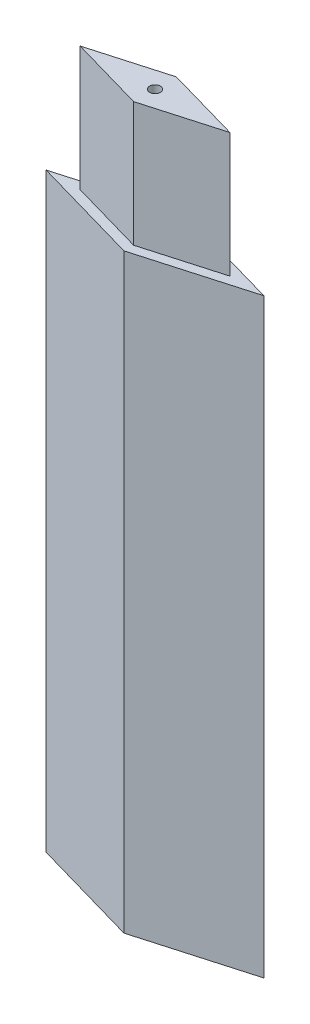
ISO-10303-21;
HEADER;
FILE_DESCRIPTION(('STEP AP214'),'2;1');
FILE_NAME('part.step','',(''),(''),'','','');
FILE_SCHEMA(('AUTOMOTIVE_DESIGN { 1 0 10303 214 1 1 1 1 }'));
ENDSEC;
DATA;
#1=APPLICATION_CONTEXT('core data for automotive mechanical design processes');
#2=APPLICATION_PROTOCOL_DEFINITION('international standard','automotive_design',2000,#1);
#3=PRODUCT_CONTEXT('',#1,'mechanical');
#4=PRODUCT('Part','Part','',(#3));
#5=PRODUCT_RELATED_PRODUCT_CATEGORY('part','',(#4));
#6=PRODUCT_DEFINITION_FORMATION('','',#4);
#7=PRODUCT_DEFINITION_CONTEXT('part definition',#1,'design');
#8=PRODUCT_DEFINITION('design','',#6,#7);
#9=PRODUCT_DEFINITION_SHAPE('','',#8);
#10=(LENGTH_UNIT() NAMED_UNIT(*) SI_UNIT(.MILLI.,.METRE.));
#11=(NAMED_UNIT(*) PLANE_ANGLE_UNIT() SI_UNIT($,.RADIAN.));
#12=(NAMED_UNIT(*) SI_UNIT($,.STERADIAN.) SOLID_ANGLE_UNIT());
#13=UNCERTAINTY_MEASURE_WITH_UNIT(LENGTH_MEASURE(1.E-05),#10,'distance_accuracy_value','');
#14=(GEOMETRIC_REPRESENTATION_CONTEXT(3) GLOBAL_UNCERTAINTY_ASSIGNED_CONTEXT((#13)) GLOBAL_UNIT_ASSIGNED_CONTEXT((#10,
#11,#12)) REPRESENTATION_CONTEXT('',''));
#15=CARTESIAN_POINT('',(0.,0.,0.));
#16=DIRECTION('',(0.,0.,1.));
#17=DIRECTION('',(1.,0.,0.));
#18=AXIS2_PLACEMENT_3D('',#15,#16,#17);
#19=CARTESIAN_POINT('',(-35.,432.,-10.000025));
#20=DIRECTION('',(0.,1.,0.));
#21=DIRECTION('',(0.,0.,1.));
#22=AXIS2_PLACEMENT_3D('',#19,#20,#21);
#23=PLANE('',#22);
#24=CARTESIAN_POINT('',(0.,432.,0.));
#25=DIRECTION('',(0.,1.,0.));
#26=DIRECTION('',(0.,0.,1.));
#27=AXIS2_PLACEMENT_3D('',#24,#25,#26);
#28=CIRCLE('',#27,1.75);
#29=CARTESIAN_POINT('',(0.,432.,1.75));
#30=VERTEX_POINT('',#29);
#31=EDGE_CURVE('E238',#30,#30,#28,.F.);
#32=ORIENTED_EDGE('',*,*,#31,.T.);
#33=EDGE_LOOP('',(#32));
#34=FACE_BOUND('',#33,.T.);
#35=DIRECTION('',(0.961523947640823,0.,-0.274721127897378));
#36=VECTOR('',#35,1.);
#37=CARTESIAN_POINT('',(0.,432.,6.87995290459406));
#38=LINE('',#37,#36);
#39=CARTESIAN_POINT('',(0.,432.,6.87995290459406));
#40=VERTEX_POINT('',#39);
#41=CARTESIAN_POINT('',(24.0798351660792,432.,0.));
#42=VERTEX_POINT('',#41);
#43=EDGE_CURVE('E171',#40,#42,#38,.T.);
#44=ORIENTED_EDGE('',*,*,#43,.T.);
#45=DIRECTION('',(-0.961523947640823,0.,-0.274721127897378));
#46=VECTOR('',#45,1.);
#47=CARTESIAN_POINT('',(24.0798351660792,432.,0.));
#48=LINE('',#47,#46);
#49=CARTESIAN_POINT('',(0.,432.,-6.87995290459406));
#50=VERTEX_POINT('',#49);
#51=EDGE_CURVE('E178',#42,#50,#48,.T.);
#52=ORIENTED_EDGE('',*,*,#51,.T.);
#53=DIRECTION('',(-0.961523947640823,0.,0.274721127897378));
#54=VECTOR('',#53,1.);
#55=CARTESIAN_POINT('',(0.,432.,-6.87995290459406));
#56=LINE('',#55,#54);
#57=CARTESIAN_POINT('',(-24.0798351660792,432.,0.));
#58=VERTEX_POINT('',#57);
#59=EDGE_CURVE('E152',#50,#58,#56,.T.);
#60=ORIENTED_EDGE('',*,*,#59,.T.);
#61=DIRECTION('',(0.961523947640823,0.,0.274721127897378));
#62=VECTOR('',#61,1.);
#63=CARTESIAN_POINT('',(-24.0798351660792,432.,0.));
#64=LINE('',#63,#62);
#65=EDGE_CURVE('E73',#58,#40,#64,.T.);
#66=ORIENTED_EDGE('',*,*,#65,.T.);
#67=EDGE_LOOP('',(#44,#52,#60,#66));
#68=FACE_BOUND('',#67,.T.);
#69=ADVANCED_FACE('F58',(#34,#68),#23,.T.);
#70=CARTESIAN_POINT('',(35.,0.,0.));
#71=DIRECTION('',(0.274721127897378,0.,-0.961523947640823));
#72=DIRECTION('',(-0.961523947640823,0.,-0.274721127897378));
#73=AXIS2_PLACEMENT_3D('',#70,#71,#72);
#74=PLANE('',#73);
#75=DIRECTION('',(0.,1.,0.));
#76=VECTOR('',#75,1.);
#77=CARTESIAN_POINT('',(0.,0.,-10.));
#78=LINE('',#77,#76);
#79=CARTESIAN_POINT('',(0.,202.,-10.));
#80=VERTEX_POINT('',#79);
#81=CARTESIAN_POINT('',(0.,392.,-10.));
#82=VERTEX_POINT('',#81);
#83=EDGE_CURVE('E243',#80,#82,#78,.T.);
#84=ORIENTED_EDGE('',*,*,#83,.T.);
#85=DIRECTION('',(0.961523947640823,0.,0.274721127897378));
#86=VECTOR('',#85,1.);
#87=CARTESIAN_POINT('',(35.,392.,0.));
#88=LINE('',#87,#86);
#89=CARTESIAN_POINT('',(35.,392.,0.));
#90=VERTEX_POINT('',#89);
#91=EDGE_CURVE('E190',#82,#90,#88,.T.);
#92=ORIENTED_EDGE('',*,*,#91,.T.);
#93=DIRECTION('',(0.,1.,0.));
#94=VECTOR('',#93,1.);
#95=CARTESIAN_POINT('',(35.,0.,0.));
#96=LINE('',#95,#94);
#97=CARTESIAN_POINT('',(35.,202.,0.));
#98=VERTEX_POINT('',#97);
#99=EDGE_CURVE('E242',#98,#90,#96,.T.);
#100=ORIENTED_EDGE('',*,*,#99,.F.);
#101=DIRECTION('',(-0.961523947640823,0.,-0.274721127897378));
#102=VECTOR('',#101,1.);
#103=CARTESIAN_POINT('',(35.,202.,0.));
#104=LINE('',#103,#102);
#105=EDGE_CURVE('E235',#98,#80,#104,.T.);
#106=ORIENTED_EDGE('',*,*,#105,.T.);
#107=EDGE_LOOP('',(#84,#92,#100,#106));
#108=FACE_BOUND('',#107,.T.);
#109=ADVANCED_FACE('F277',(#108),#74,.T.);
#110=CARTESIAN_POINT('',(0.,0.,-10.));
#111=DIRECTION('',(-0.274721127897378,0.,-0.961523947640823));
#112=DIRECTION('',(-0.961523947640823,0.,0.274721127897378));
#113=AXIS2_PLACEMENT_3D('',#110,#111,#112);
#114=PLANE('',#113);
#115=DIRECTION('',(0.,1.,0.));
#116=VECTOR('',#115,1.);
#117=CARTESIAN_POINT('',(-35.,0.,0.));
#118=LINE('',#117,#116);
#119=CARTESIAN_POINT('',(-35.,202.,0.));
#120=VERTEX_POINT('',#119);
#121=CARTESIAN_POINT('',(-35.,392.,0.));
#122=VERTEX_POINT('',#121);
#123=EDGE_CURVE('E66',#120,#122,#118,.T.);
#124=ORIENTED_EDGE('',*,*,#123,.T.);
#125=DIRECTION('',(0.961523947640823,0.,-0.274721127897378));
#126=VECTOR('',#125,1.);
#127=CARTESIAN_POINT('',(0.,392.,-10.));
#128=LINE('',#127,#126);
#129=EDGE_CURVE('E187',#122,#82,#128,.T.);
#130=ORIENTED_EDGE('',*,*,#129,.T.);
#131=ORIENTED_EDGE('',*,*,#83,.F.);
#132=DIRECTION('',(-0.961523947640823,0.,0.274721127897378));
#133=VECTOR('',#132,1.);
#134=CARTESIAN_POINT('',(0.,202.,-10.));
#135=LINE('',#134,#133);
#136=EDGE_CURVE('E232',#80,#120,#135,.T.);
#137=ORIENTED_EDGE('',*,*,#136,.T.);
#138=EDGE_LOOP('',(#124,#130,#131,#137));
#139=FACE_BOUND('',#138,.T.);
#140=ADVANCED_FACE('F60',(#139),#114,.T.);
#141=CARTESIAN_POINT('',(0.,0.,10.));
#142=DIRECTION('',(-0.274721127897378,0.,0.961523947640823));
#143=DIRECTION('',(0.961523947640823,0.,0.274721127897378));
#144=AXIS2_PLACEMENT_3D('',#141,#142,#143);
#145=PLANE('',#144);
#146=DIRECTION('',(0.,1.,0.));
#147=VECTOR('',#146,1.);
#148=CARTESIAN_POINT('',(0.,0.,10.));
#149=LINE('',#148,#147);
#150=CARTESIAN_POINT('',(0.,202.,10.));
#151=VERTEX_POINT('',#150);
#152=CARTESIAN_POINT('',(0.,392.,10.));
#153=VERTEX_POINT('',#152);
#154=EDGE_CURVE('E239',#151,#153,#149,.T.);
#155=ORIENTED_EDGE('',*,*,#154,.T.);
#156=DIRECTION('',(-0.961523947640823,0.,-0.274721127897378));
#157=VECTOR('',#156,1.);
#158=CARTESIAN_POINT('',(0.,392.,10.));
#159=LINE('',#158,#157);
#160=EDGE_CURVE('E81',#153,#122,#159,.T.);
#161=ORIENTED_EDGE('',*,*,#160,.T.);
#162=ORIENTED_EDGE('',*,*,#123,.F.);
#163=DIRECTION('',(0.961523947640823,0.,0.274721127897378));
#164=VECTOR('',#163,1.);
#165=CARTESIAN_POINT('',(0.,202.,10.));
#166=LINE('',#165,#164);
#167=EDGE_CURVE('E229',#120,#151,#166,.T.);
#168=ORIENTED_EDGE('',*,*,#167,.T.);
#169=EDGE_LOOP('',(#155,#161,#162,#168));
#170=FACE_BOUND('',#169,.T.);
#171=ADVANCED_FACE('F271',(#170),#145,.T.);
#172=CARTESIAN_POINT('',(35.,0.,0.));
#173=DIRECTION('',(0.274721127897378,0.,0.961523947640823));
#174=DIRECTION('',(0.961523947640823,0.,-0.274721127897378));
#175=AXIS2_PLACEMENT_3D('',#172,#173,#174);
#176=PLANE('',#175);
#177=ORIENTED_EDGE('',*,*,#99,.T.);
#178=DIRECTION('',(-0.961523947640823,0.,0.274721127897378));
#179=VECTOR('',#178,1.);
#180=CARTESIAN_POINT('',(35.,392.,0.));
#181=LINE('',#180,#179);
#182=EDGE_CURVE('E13',#90,#153,#181,.T.);
#183=ORIENTED_EDGE('',*,*,#182,.T.);
#184=ORIENTED_EDGE('',*,*,#154,.F.);
#185=DIRECTION('',(0.961523947640823,0.,-0.274721127897378));
#186=VECTOR('',#185,1.);
#187=CARTESIAN_POINT('',(35.,202.,0.));
#188=LINE('',#187,#186);
#189=EDGE_CURVE('E226',#151,#98,#188,.T.);
#190=ORIENTED_EDGE('',*,*,#189,.T.);
#191=EDGE_LOOP('',(#177,#183,#184,#190));
#192=FACE_BOUND('',#191,.T.);
#193=ADVANCED_FACE('F262',(#192),#176,.T.);
#194=CARTESIAN_POINT('',(0.,612.,0.));
#195=DIRECTION('',(0.,-1.,0.));
#196=DIRECTION('',(0.,0.,-1.));
#197=AXIS2_PLACEMENT_3D('',#194,#195,#196);
#198=CYLINDRICAL_SURFACE('',#197,1.75);
#199=ORIENTED_EDGE('',*,*,#31,.F.);
#200=EDGE_LOOP('',(#199));
#201=FACE_BOUND('',#200,.T.);
#202=CARTESIAN_POINT('',(0.,243.,0.));
#203=DIRECTION('',(0.,-1.,0.));
#204=DIRECTION('',(0.,0.,-1.));
#205=AXIS2_PLACEMENT_3D('',#202,#203,#204);
#206=CIRCLE('',#205,1.75);
#207=CARTESIAN_POINT('',(0.,243.,-1.75));
#208=VERTEX_POINT('',#207);
#209=EDGE_CURVE('E219',#208,#208,#206,.F.);
#210=ORIENTED_EDGE('',*,*,#209,.F.);
#211=EDGE_LOOP('',(#210));
#212=FACE_BOUND('',#211,.T.);
#213=ADVANCED_FACE('F259',(#201,#212),#198,.F.);
#214=CARTESIAN_POINT('',(-35.,202.,-10.000025));
#215=DIRECTION('',(0.,-1.,0.));
#216=DIRECTION('',(0.,0.,-1.));
#217=AXIS2_PLACEMENT_3D('',#214,#215,#216);
#218=PLANE('',#217);
#219=DIRECTION('',(0.961523947640823,0.,0.274721127897378));
#220=VECTOR('',#219,1.);
#221=CARTESIAN_POINT('',(0.,202.,-7.08795604428779));
#222=LINE('',#221,#220);
#223=CARTESIAN_POINT('',(0.,202.,-7.08795604428779));
#224=VERTEX_POINT('',#223);
#225=CARTESIAN_POINT('',(24.8078461550073,202.,0.));
#226=VERTEX_POINT('',#225);
#227=EDGE_CURVE('E193',#224,#226,#222,.T.);
#228=ORIENTED_EDGE('',*,*,#227,.F.);
#229=DIRECTION('',(0.961523947640823,0.,-0.274721127897378));
#230=VECTOR('',#229,1.);
#231=CARTESIAN_POINT('',(-24.8078461550073,202.,0.));
#232=LINE('',#231,#230);
#233=CARTESIAN_POINT('',(-24.8078461550073,202.,0.));
#234=VERTEX_POINT('',#233);
#235=EDGE_CURVE('E198',#234,#224,#232,.T.);
#236=ORIENTED_EDGE('',*,*,#235,.F.);
#237=DIRECTION('',(-0.961523947640823,0.,-0.274721127897378));
#238=VECTOR('',#237,1.);
#239=CARTESIAN_POINT('',(0.,202.,7.08795604428779));
#240=LINE('',#239,#238);
#241=CARTESIAN_POINT('',(0.,202.,7.08795604428779));
#242=VERTEX_POINT('',#241);
#243=EDGE_CURVE('E212',#242,#234,#240,.T.);
#244=ORIENTED_EDGE('',*,*,#243,.F.);
#245=DIRECTION('',(-0.961523947640823,0.,0.274721127897378));
#246=VECTOR('',#245,1.);
#247=CARTESIAN_POINT('',(24.8078461550073,202.,0.));
#248=LINE('',#247,#246);
#249=EDGE_CURVE('E209',#226,#242,#248,.T.);
#250=ORIENTED_EDGE('',*,*,#249,.F.);
#251=EDGE_LOOP('',(#228,#236,#244,#250));
#252=FACE_BOUND('',#251,.T.);
#253=ORIENTED_EDGE('',*,*,#189,.F.);
#254=ORIENTED_EDGE('',*,*,#167,.F.);
#255=ORIENTED_EDGE('',*,*,#136,.F.);
#256=ORIENTED_EDGE('',*,*,#105,.F.);
#257=EDGE_LOOP('',(#253,#254,#255,#256));
#258=FACE_BOUND('',#257,.T.);
#259=ADVANCED_FACE('F261',(#252,#258),#218,.T.);
#260=CARTESIAN_POINT('',(0.,243.,0.));
#261=DIRECTION('',(0.,-1.,0.));
#262=DIRECTION('',(0.,0.,-1.));
#263=AXIS2_PLACEMENT_3D('',#260,#261,#262);
#264=PLANE('',#263);
#265=DIRECTION('',(0.961523947640823,0.,0.274721127897378));
#266=VECTOR('',#265,1.);
#267=CARTESIAN_POINT('',(0.,243.,-7.08795604428779));
#268=LINE('',#267,#266);
#269=CARTESIAN_POINT('',(0.,243.,-7.08795604428779));
#270=VERTEX_POINT('',#269);
#271=CARTESIAN_POINT('',(24.8078461550073,243.,0.));
#272=VERTEX_POINT('',#271);
#273=EDGE_CURVE('E194',#270,#272,#268,.T.);
#274=ORIENTED_EDGE('',*,*,#273,.T.);
#275=DIRECTION('',(-0.961523947640823,0.,0.274721127897378));
#276=VECTOR('',#275,1.);
#277=CARTESIAN_POINT('',(24.8078461550073,243.,0.));
#278=LINE('',#277,#276);
#279=CARTESIAN_POINT('',(0.,243.,7.08795604428779));
#280=VERTEX_POINT('',#279);
#281=EDGE_CURVE('E197',#272,#280,#278,.T.);
#282=ORIENTED_EDGE('',*,*,#281,.T.);
#283=DIRECTION('',(-0.961523947640823,0.,-0.274721127897378));
#284=VECTOR('',#283,1.);
#285=CARTESIAN_POINT('',(0.,243.,7.08795604428779));
#286=LINE('',#285,#284);
#287=CARTESIAN_POINT('',(-24.8078461550073,243.,0.));
#288=VERTEX_POINT('',#287);
#289=EDGE_CURVE('E201',#280,#288,#286,.T.);
#290=ORIENTED_EDGE('',*,*,#289,.T.);
#291=DIRECTION('',(0.961523947640823,0.,-0.274721127897378));
#292=VECTOR('',#291,1.);
#293=CARTESIAN_POINT('',(-24.8078461550073,243.,0.));
#294=LINE('',#293,#292);
#295=EDGE_CURVE('E204',#288,#270,#294,.T.);
#296=ORIENTED_EDGE('',*,*,#295,.T.);
#297=EDGE_LOOP('',(#274,#282,#290,#296));
#298=FACE_BOUND('',#297,.T.);
#299=ORIENTED_EDGE('',*,*,#209,.T.);
#300=EDGE_LOOP('',(#299));
#301=FACE_BOUND('',#300,.T.);
#302=ADVANCED_FACE('F257',(#298,#301),#264,.T.);
#303=CARTESIAN_POINT('',(0.,243.,-7.08795604428779));
#304=DIRECTION('',(0.274721127897378,0.,-0.961523947640823));
#305=DIRECTION('',(-0.961523947640823,0.,-0.274721127897378));
#306=AXIS2_PLACEMENT_3D('',#303,#304,#305);
#307=PLANE('',#306);
#308=ORIENTED_EDGE('',*,*,#227,.T.);
#309=DIRECTION('',(0.,-1.,0.));
#310=VECTOR('',#309,1.);
#311=CARTESIAN_POINT('',(24.8078461550073,243.,0.));
#312=LINE('',#311,#310);
#313=EDGE_CURVE('E207',#272,#226,#312,.T.);
#314=ORIENTED_EDGE('',*,*,#313,.F.);
#315=ORIENTED_EDGE('',*,*,#273,.F.);
#316=DIRECTION('',(0.,-1.,0.));
#317=VECTOR('',#316,1.);
#318=CARTESIAN_POINT('',(0.,243.,-7.08795604428779));
#319=LINE('',#318,#317);
#320=EDGE_CURVE('E217',#270,#224,#319,.T.);
#321=ORIENTED_EDGE('',*,*,#320,.T.);
#322=EDGE_LOOP('',(#308,#314,#315,#321));
#323=FACE_BOUND('',#322,.T.);
#324=ADVANCED_FACE('F287',(#323),#307,.F.);
#325=CARTESIAN_POINT('',(-24.8078461550073,243.,0.));
#326=DIRECTION('',(-0.274721127897378,0.,-0.961523947640823));
#327=DIRECTION('',(-0.961523947640823,0.,0.274721127897378));
#328=AXIS2_PLACEMENT_3D('',#325,#326,#327);
#329=PLANE('',#328);
#330=ORIENTED_EDGE('',*,*,#235,.T.);
#331=ORIENTED_EDGE('',*,*,#320,.F.);
#332=ORIENTED_EDGE('',*,*,#295,.F.);
#333=DIRECTION('',(0.,-1.,0.));
#334=VECTOR('',#333,1.);
#335=CARTESIAN_POINT('',(-24.8078461550073,243.,0.));
#336=LINE('',#335,#334);
#337=EDGE_CURVE('E220',#288,#234,#336,.T.);
#338=ORIENTED_EDGE('',*,*,#337,.T.);
#339=EDGE_LOOP('',(#330,#331,#332,#338));
#340=FACE_BOUND('',#339,.T.);
#341=ADVANCED_FACE('F290',(#340),#329,.F.);
#342=CARTESIAN_POINT('',(0.,243.,7.08795604428779));
#343=DIRECTION('',(-0.274721127897378,0.,0.961523947640823));
#344=DIRECTION('',(0.961523947640823,0.,0.274721127897378));
#345=AXIS2_PLACEMENT_3D('',#342,#343,#344);
#346=PLANE('',#345);
#347=ORIENTED_EDGE('',*,*,#243,.T.);
#348=ORIENTED_EDGE('',*,*,#337,.F.);
#349=ORIENTED_EDGE('',*,*,#289,.F.);
#350=DIRECTION('',(0.,-1.,0.));
#351=VECTOR('',#350,1.);
#352=CARTESIAN_POINT('',(0.,243.,7.08795604428779));
#353=LINE('',#352,#351);
#354=EDGE_CURVE('E222',#280,#242,#353,.T.);
#355=ORIENTED_EDGE('',*,*,#354,.T.);
#356=EDGE_LOOP('',(#347,#348,#349,#355));
#357=FACE_BOUND('',#356,.T.);
#358=ADVANCED_FACE('F295',(#357),#346,.F.);
#359=CARTESIAN_POINT('',(24.8078461550073,243.,0.));
#360=DIRECTION('',(0.274721127897378,0.,0.961523947640823));
#361=DIRECTION('',(0.961523947640823,0.,-0.274721127897378));
#362=AXIS2_PLACEMENT_3D('',#359,#360,#361);
#363=PLANE('',#362);
#364=ORIENTED_EDGE('',*,*,#249,.T.);
#365=ORIENTED_EDGE('',*,*,#354,.F.);
#366=ORIENTED_EDGE('',*,*,#281,.F.);
#367=ORIENTED_EDGE('',*,*,#313,.T.);
#368=EDGE_LOOP('',(#364,#365,#366,#367));
#369=FACE_BOUND('',#368,.T.);
#370=ADVANCED_FACE('F292',(#369),#363,.F.);
#371=CARTESIAN_POINT('',(0.,392.,0.));
#372=DIRECTION('',(0.,1.,0.));
#373=DIRECTION('',(0.,0.,1.));
#374=AXIS2_PLACEMENT_3D('',#371,#372,#373);
#375=PLANE('',#374);
#376=ORIENTED_EDGE('',*,*,#129,.F.);
#377=ORIENTED_EDGE('',*,*,#160,.F.);
#378=ORIENTED_EDGE('',*,*,#182,.F.);
#379=ORIENTED_EDGE('',*,*,#91,.F.);
#380=EDGE_LOOP('',(#376,#377,#378,#379));
#381=FACE_BOUND('',#380,.T.);
#382=DIRECTION('',(0.961523947640823,0.,-0.274721127897378));
#383=VECTOR('',#382,1.);
#384=CARTESIAN_POINT('',(0.,392.,6.87995290459406));
#385=LINE('',#384,#383);
#386=CARTESIAN_POINT('',(0.,392.,6.87995290459406));
#387=VERTEX_POINT('',#386);
#388=CARTESIAN_POINT('',(24.0798351660792,392.,0.));
#389=VERTEX_POINT('',#388);
#390=EDGE_CURVE('E158',#387,#389,#385,.T.);
#391=ORIENTED_EDGE('',*,*,#390,.F.);
#392=DIRECTION('',(0.961523947640823,0.,0.274721127897378));
#393=VECTOR('',#392,1.);
#394=CARTESIAN_POINT('',(-24.0798351660792,392.,0.));
#395=LINE('',#394,#393);
#396=CARTESIAN_POINT('',(-24.0798351660792,392.,0.));
#397=VERTEX_POINT('',#396);
#398=EDGE_CURVE('E167',#397,#387,#395,.T.);
#399=ORIENTED_EDGE('',*,*,#398,.F.);
#400=DIRECTION('',(-0.961523947640823,0.,0.274721127897378));
#401=VECTOR('',#400,1.);
#402=CARTESIAN_POINT('',(0.,392.,-6.87995290459406));
#403=LINE('',#402,#401);
#404=CARTESIAN_POINT('',(0.,392.,-6.87995290459406));
#405=VERTEX_POINT('',#404);
#406=EDGE_CURVE('E150',#405,#397,#403,.T.);
#407=ORIENTED_EDGE('',*,*,#406,.F.);
#408=DIRECTION('',(-0.961523947640823,0.,-0.274721127897378));
#409=VECTOR('',#408,1.);
#410=CARTESIAN_POINT('',(24.0798351660792,392.,0.));
#411=LINE('',#410,#409);
#412=EDGE_CURVE('E164',#389,#405,#411,.T.);
#413=ORIENTED_EDGE('',*,*,#412,.F.);
#414=EDGE_LOOP('',(#391,#399,#407,#413));
#415=FACE_BOUND('',#414,.T.);
#416=ADVANCED_FACE('F163',(#381,#415),#375,.T.);
#417=CARTESIAN_POINT('',(24.0798351660792,392.,0.));
#418=DIRECTION('',(0.274721127897378,0.,-0.961523947640823));
#419=DIRECTION('',(-0.961523947640823,0.,-0.274721127897378));
#420=AXIS2_PLACEMENT_3D('',#417,#418,#419);
#421=PLANE('',#420);
#422=ORIENTED_EDGE('',*,*,#51,.F.);
#423=DIRECTION('',(0.,1.,0.));
#424=VECTOR('',#423,1.);
#425=CARTESIAN_POINT('',(24.0798351660792,392.,0.));
#426=LINE('',#425,#424);
#427=EDGE_CURVE('E170',#389,#42,#426,.T.);
#428=ORIENTED_EDGE('',*,*,#427,.F.);
#429=ORIENTED_EDGE('',*,*,#412,.T.);
#430=DIRECTION('',(0.,1.,0.));
#431=VECTOR('',#430,1.);
#432=CARTESIAN_POINT('',(0.,392.,-6.87995290459406));
#433=LINE('',#432,#431);
#434=EDGE_CURVE('E147',#405,#50,#433,.T.);
#435=ORIENTED_EDGE('',*,*,#434,.T.);
#436=EDGE_LOOP('',(#422,#428,#429,#435));
#437=FACE_BOUND('',#436,.T.);
#438=ADVANCED_FACE('F169',(#437),#421,.T.);
#439=CARTESIAN_POINT('',(0.,392.,6.87995290459406));
#440=DIRECTION('',(0.274721127897378,0.,0.961523947640823));
#441=DIRECTION('',(0.961523947640823,0.,-0.274721127897378));
#442=AXIS2_PLACEMENT_3D('',#439,#440,#441);
#443=PLANE('',#442);
#444=ORIENTED_EDGE('',*,*,#43,.F.);
#445=DIRECTION('',(0.,1.,0.));
#446=VECTOR('',#445,1.);
#447=CARTESIAN_POINT('',(0.,392.,6.87995290459406));
#448=LINE('',#447,#446);
#449=EDGE_CURVE('E183',#387,#40,#448,.T.);
#450=ORIENTED_EDGE('',*,*,#449,.F.);
#451=ORIENTED_EDGE('',*,*,#390,.T.);
#452=ORIENTED_EDGE('',*,*,#427,.T.);
#453=EDGE_LOOP('',(#444,#450,#451,#452));
#454=FACE_BOUND('',#453,.T.);
#455=ADVANCED_FACE('F310',(#454),#443,.T.);
#456=CARTESIAN_POINT('',(-24.0798351660792,392.,0.));
#457=DIRECTION('',(-0.274721127897378,0.,0.961523947640823));
#458=DIRECTION('',(0.961523947640823,0.,0.274721127897378));
#459=AXIS2_PLACEMENT_3D('',#456,#457,#458);
#460=PLANE('',#459);
#461=ORIENTED_EDGE('',*,*,#65,.F.);
#462=DIRECTION('',(0.,1.,0.));
#463=VECTOR('',#462,1.);
#464=CARTESIAN_POINT('',(-24.0798351660792,392.,0.));
#465=LINE('',#464,#463);
#466=EDGE_CURVE('E157',#397,#58,#465,.T.);
#467=ORIENTED_EDGE('',*,*,#466,.F.);
#468=ORIENTED_EDGE('',*,*,#398,.T.);
#469=ORIENTED_EDGE('',*,*,#449,.T.);
#470=EDGE_LOOP('',(#461,#467,#468,#469));
#471=FACE_BOUND('',#470,.T.);
#472=ADVANCED_FACE('F313',(#471),#460,.T.);
#473=CARTESIAN_POINT('',(0.,392.,-6.87995290459406));
#474=DIRECTION('',(-0.274721127897378,0.,-0.961523947640823));
#475=DIRECTION('',(-0.961523947640823,0.,0.274721127897378));
#476=AXIS2_PLACEMENT_3D('',#473,#474,#475);
#477=PLANE('',#476);
#478=ORIENTED_EDGE('',*,*,#59,.F.);
#479=ORIENTED_EDGE('',*,*,#434,.F.);
#480=ORIENTED_EDGE('',*,*,#406,.T.);
#481=ORIENTED_EDGE('',*,*,#466,.T.);
#482=EDGE_LOOP('',(#478,#479,#480,#481));
#483=FACE_BOUND('',#482,.T.);
#484=ADVANCED_FACE('F149',(#483),#477,.T.);
#485=CLOSED_SHELL('',(#69,#109,#140,#171,#193,#213,#259,#302,#324,#341,#358,#370,#416,#438,#455,
#472,#484));
#486=MANIFOLD_SOLID_BREP('B2',#485);
#487=ADVANCED_BREP_SHAPE_REPRESENTATION('',(#18,#486),#14);
#488=SHAPE_DEFINITION_REPRESENTATION(#9,#487);
ENDSEC;
END-ISO-10303-21;
